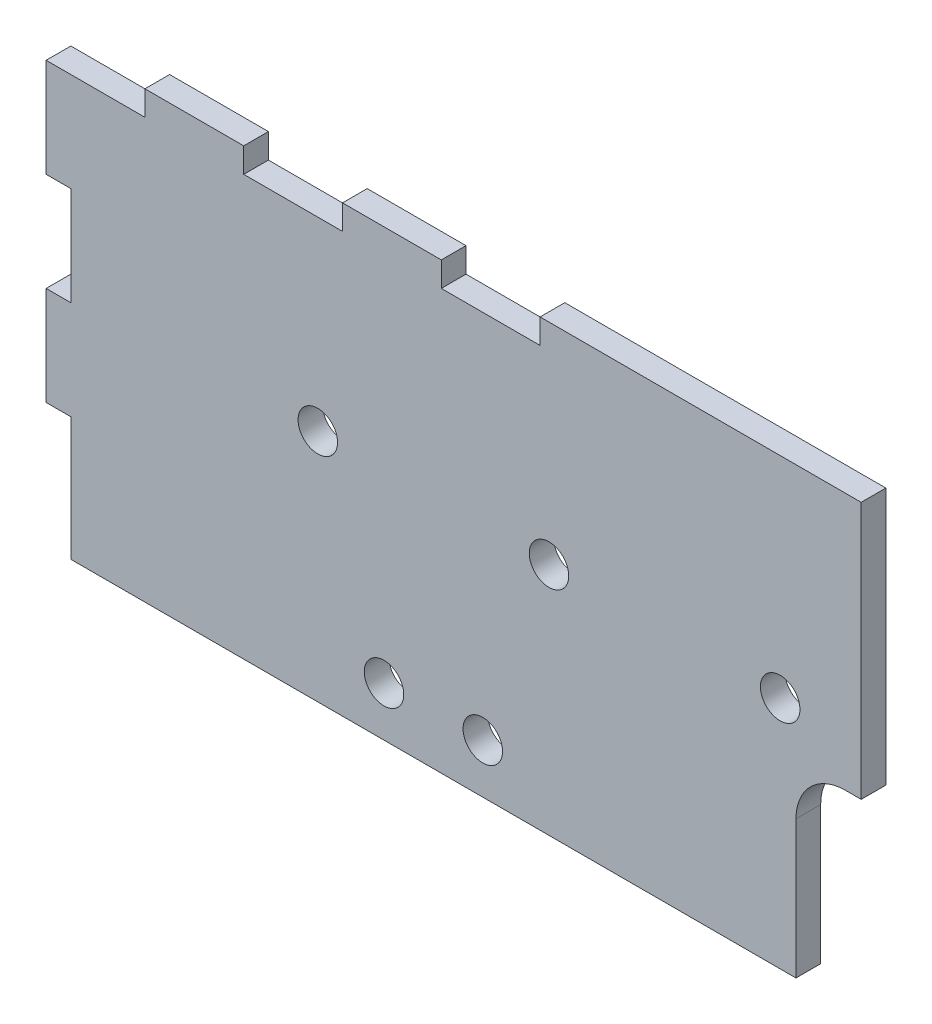
ISO-10303-21;
HEADER;
FILE_DESCRIPTION(('STEP AP214'),'2;1');
FILE_NAME('part.step','',(''),(''),'','','');
FILE_SCHEMA(('AUTOMOTIVE_DESIGN { 1 0 10303 214 1 1 1 1 }'));
ENDSEC;
DATA;
#1=APPLICATION_CONTEXT('core data for automotive mechanical design processes');
#2=APPLICATION_PROTOCOL_DEFINITION('international standard','automotive_design',2000,#1);
#3=PRODUCT_CONTEXT('',#1,'mechanical');
#4=PRODUCT('Part','Part','',(#3));
#5=PRODUCT_RELATED_PRODUCT_CATEGORY('part','',(#4));
#6=PRODUCT_DEFINITION_FORMATION('','',#4);
#7=PRODUCT_DEFINITION_CONTEXT('part definition',#1,'design');
#8=PRODUCT_DEFINITION('design','',#6,#7);
#9=PRODUCT_DEFINITION_SHAPE('','',#8);
#10=(LENGTH_UNIT() NAMED_UNIT(*) SI_UNIT(.MILLI.,.METRE.));
#11=(NAMED_UNIT(*) PLANE_ANGLE_UNIT() SI_UNIT($,.RADIAN.));
#12=(NAMED_UNIT(*) SI_UNIT($,.STERADIAN.) SOLID_ANGLE_UNIT());
#13=UNCERTAINTY_MEASURE_WITH_UNIT(LENGTH_MEASURE(1.E-05),#10,'distance_accuracy_value','');
#14=(GEOMETRIC_REPRESENTATION_CONTEXT(3) GLOBAL_UNCERTAINTY_ASSIGNED_CONTEXT((#13)) GLOBAL_UNIT_ASSIGNED_CONTEXT((#10,
#11,#12)) REPRESENTATION_CONTEXT('',''));
#15=CARTESIAN_POINT('',(0.,0.,0.));
#16=DIRECTION('',(0.,0.,1.));
#17=DIRECTION('',(1.,0.,0.));
#18=AXIS2_PLACEMENT_3D('',#15,#16,#17);
#19=CARTESIAN_POINT('',(40.259,6.35,3.175));
#20=DIRECTION('',(0.,0.,-1.));
#21=DIRECTION('',(-1.,0.,0.));
#22=AXIS2_PLACEMENT_3D('',#19,#20,#21);
#23=CYLINDRICAL_SURFACE('',#22,2.54);
#24=CARTESIAN_POINT('',(40.259,6.35,3.175));
#25=DIRECTION('',(0.,0.,1.));
#26=DIRECTION('',(1.,0.,0.));
#27=AXIS2_PLACEMENT_3D('',#24,#25,#26);
#28=CIRCLE('',#27,2.54);
#29=CARTESIAN_POINT('',(42.799,6.35,3.175));
#30=VERTEX_POINT('',#29);
#31=EDGE_CURVE('E529',#30,#30,#28,.T.);
#32=ORIENTED_EDGE('',*,*,#31,.T.);
#33=EDGE_LOOP('',(#32));
#34=FACE_BOUND('',#33,.T.);
#35=CARTESIAN_POINT('',(40.259,6.35,0.));
#36=DIRECTION('',(0.,0.,1.));
#37=DIRECTION('',(1.,0.,0.));
#38=AXIS2_PLACEMENT_3D('',#35,#36,#37);
#39=CIRCLE('',#38,2.54);
#40=CARTESIAN_POINT('',(42.799,6.35,0.));
#41=VERTEX_POINT('',#40);
#42=EDGE_CURVE('E379',#41,#41,#39,.T.);
#43=ORIENTED_EDGE('',*,*,#42,.F.);
#44=EDGE_LOOP('',(#43));
#45=FACE_BOUND('',#44,.T.);
#46=ADVANCED_FACE('F210',(#34,#45),#23,.F.);
#47=CARTESIAN_POINT('',(52.959,6.35,3.175));
#48=DIRECTION('',(0.,0.,-1.));
#49=DIRECTION('',(-1.,0.,0.));
#50=AXIS2_PLACEMENT_3D('',#47,#48,#49);
#51=CYLINDRICAL_SURFACE('',#50,2.54);
#52=CARTESIAN_POINT('',(52.959,6.35,3.175));
#53=DIRECTION('',(0.,0.,1.));
#54=DIRECTION('',(1.,0.,0.));
#55=AXIS2_PLACEMENT_3D('',#52,#53,#54);
#56=CIRCLE('',#55,2.54);
#57=CARTESIAN_POINT('',(55.499,6.35,3.175));
#58=VERTEX_POINT('',#57);
#59=EDGE_CURVE('E586',#58,#58,#56,.T.);
#60=ORIENTED_EDGE('',*,*,#59,.T.);
#61=EDGE_LOOP('',(#60));
#62=FACE_BOUND('',#61,.T.);
#63=CARTESIAN_POINT('',(52.959,6.35,0.));
#64=DIRECTION('',(0.,0.,1.));
#65=DIRECTION('',(1.,0.,0.));
#66=AXIS2_PLACEMENT_3D('',#63,#64,#65);
#67=CIRCLE('',#66,2.54);
#68=CARTESIAN_POINT('',(55.499,6.35,0.));
#69=VERTEX_POINT('',#68);
#70=EDGE_CURVE('E521',#69,#69,#67,.T.);
#71=ORIENTED_EDGE('',*,*,#70,.F.);
#72=EDGE_LOOP('',(#71));
#73=FACE_BOUND('',#72,.T.);
#74=ADVANCED_FACE('F641',(#62,#73),#51,.F.);
#75=CARTESIAN_POINT('',(31.75,30.1498,3.175));
#76=DIRECTION('',(0.,0.,-1.));
#77=DIRECTION('',(-1.,0.,0.));
#78=AXIS2_PLACEMENT_3D('',#75,#76,#77);
#79=CYLINDRICAL_SURFACE('',#78,2.54);
#80=CARTESIAN_POINT('',(31.75,30.1498,3.175));
#81=DIRECTION('',(0.,0.,1.));
#82=DIRECTION('',(1.,0.,0.));
#83=AXIS2_PLACEMENT_3D('',#80,#81,#82);
#84=CIRCLE('',#83,2.54);
#85=CARTESIAN_POINT('',(34.29,30.1498,3.175));
#86=VERTEX_POINT('',#85);
#87=EDGE_CURVE('E583',#86,#86,#84,.T.);
#88=ORIENTED_EDGE('',*,*,#87,.T.);
#89=EDGE_LOOP('',(#88));
#90=FACE_BOUND('',#89,.T.);
#91=CARTESIAN_POINT('',(31.75,30.1498,0.));
#92=DIRECTION('',(0.,0.,1.));
#93=DIRECTION('',(1.,0.,0.));
#94=AXIS2_PLACEMENT_3D('',#91,#92,#93);
#95=CIRCLE('',#94,2.54);
#96=CARTESIAN_POINT('',(34.29,30.1498,0.));
#97=VERTEX_POINT('',#96);
#98=EDGE_CURVE('E518',#97,#97,#95,.T.);
#99=ORIENTED_EDGE('',*,*,#98,.F.);
#100=EDGE_LOOP('',(#99));
#101=FACE_BOUND('',#100,.T.);
#102=ADVANCED_FACE('F647',(#90,#101),#79,.F.);
#103=CARTESIAN_POINT('',(61.468,30.1498,3.175));
#104=DIRECTION('',(0.,0.,-1.));
#105=DIRECTION('',(-1.,0.,0.));
#106=AXIS2_PLACEMENT_3D('',#103,#104,#105);
#107=CYLINDRICAL_SURFACE('',#106,2.54);
#108=CARTESIAN_POINT('',(61.468,30.1498,3.175));
#109=DIRECTION('',(0.,0.,1.));
#110=DIRECTION('',(1.,0.,0.));
#111=AXIS2_PLACEMENT_3D('',#108,#109,#110);
#112=CIRCLE('',#111,2.54);
#113=CARTESIAN_POINT('',(64.008,30.1498,3.175));
#114=VERTEX_POINT('',#113);
#115=EDGE_CURVE('E580',#114,#114,#112,.T.);
#116=ORIENTED_EDGE('',*,*,#115,.T.);
#117=EDGE_LOOP('',(#116));
#118=FACE_BOUND('',#117,.T.);
#119=CARTESIAN_POINT('',(61.468,30.1498,0.));
#120=DIRECTION('',(0.,0.,1.));
#121=DIRECTION('',(1.,0.,0.));
#122=AXIS2_PLACEMENT_3D('',#119,#120,#121);
#123=CIRCLE('',#122,2.54);
#124=CARTESIAN_POINT('',(64.008,30.1498,0.));
#125=VERTEX_POINT('',#124);
#126=EDGE_CURVE('E515',#125,#125,#123,.T.);
#127=ORIENTED_EDGE('',*,*,#126,.F.);
#128=EDGE_LOOP('',(#127));
#129=FACE_BOUND('',#128,.T.);
#130=ADVANCED_FACE('F656',(#118,#129),#107,.F.);
#131=CARTESIAN_POINT('',(91.186,30.1498,3.175));
#132=DIRECTION('',(0.,0.,-1.));
#133=DIRECTION('',(-1.,0.,0.));
#134=AXIS2_PLACEMENT_3D('',#131,#132,#133);
#135=CYLINDRICAL_SURFACE('',#134,2.54);
#136=CARTESIAN_POINT('',(91.186,30.1498,3.175));
#137=DIRECTION('',(0.,0.,1.));
#138=DIRECTION('',(1.,0.,0.));
#139=AXIS2_PLACEMENT_3D('',#136,#137,#138);
#140=CIRCLE('',#139,2.54);
#141=CARTESIAN_POINT('',(93.726,30.1498,3.175));
#142=VERTEX_POINT('',#141);
#143=EDGE_CURVE('E577',#142,#142,#140,.T.);
#144=ORIENTED_EDGE('',*,*,#143,.T.);
#145=EDGE_LOOP('',(#144));
#146=FACE_BOUND('',#145,.T.);
#147=CARTESIAN_POINT('',(91.186,30.1498,0.));
#148=DIRECTION('',(0.,0.,1.));
#149=DIRECTION('',(1.,0.,0.));
#150=AXIS2_PLACEMENT_3D('',#147,#148,#149);
#151=CIRCLE('',#150,2.54);
#152=CARTESIAN_POINT('',(93.726,30.1498,0.));
#153=VERTEX_POINT('',#152);
#154=EDGE_CURVE('E512',#153,#153,#151,.T.);
#155=ORIENTED_EDGE('',*,*,#154,.F.);
#156=EDGE_LOOP('',(#155));
#157=FACE_BOUND('',#156,.T.);
#158=ADVANCED_FACE('F660',(#146,#157),#135,.F.);
#159=CARTESIAN_POINT('',(0.,53.975,3.175));
#160=DIRECTION('',(0.,-1.,0.));
#161=DIRECTION('',(0.,0.,-1.));
#162=AXIS2_PLACEMENT_3D('',#159,#160,#161);
#163=PLANE('',#162);
#164=DIRECTION('',(0.,0.,-1.));
#165=VECTOR('',#164,1.);
#166=CARTESIAN_POINT('',(47.625,53.975,3.175));
#167=LINE('',#166,#165);
#168=CARTESIAN_POINT('',(47.625,53.975,3.175));
#169=VERTEX_POINT('',#168);
#170=CARTESIAN_POINT('',(47.625,53.975,0.));
#171=VERTEX_POINT('',#170);
#172=EDGE_CURVE('E403',#169,#171,#167,.T.);
#173=ORIENTED_EDGE('',*,*,#172,.F.);
#174=DIRECTION('',(-1.,0.,0.));
#175=VECTOR('',#174,1.);
#176=CARTESIAN_POINT('',(0.,53.975,3.175));
#177=LINE('',#176,#175);
#178=CARTESIAN_POINT('',(60.325,53.975,3.175));
#179=VERTEX_POINT('',#178);
#180=EDGE_CURVE('E381',#179,#169,#177,.T.);
#181=ORIENTED_EDGE('',*,*,#180,.F.);
#182=DIRECTION('',(0.,0.,-1.));
#183=VECTOR('',#182,1.);
#184=CARTESIAN_POINT('',(60.325,53.975,3.175));
#185=LINE('',#184,#183);
#186=CARTESIAN_POINT('',(60.325,53.975,0.));
#187=VERTEX_POINT('',#186);
#188=EDGE_CURVE('E406',#179,#187,#185,.T.);
#189=ORIENTED_EDGE('',*,*,#188,.T.);
#190=DIRECTION('',(-1.,0.,0.));
#191=VECTOR('',#190,1.);
#192=CARTESIAN_POINT('',(0.,53.975,0.));
#193=LINE('',#192,#191);
#194=EDGE_CURVE('E552',#187,#171,#193,.T.);
#195=ORIENTED_EDGE('',*,*,#194,.T.);
#196=EDGE_LOOP('',(#173,#181,#189,#195));
#197=FACE_BOUND('',#196,.T.);
#198=ADVANCED_FACE('F594',(#197),#163,.F.);
#199=DIRECTION('',(0.,0.,-1.));
#200=VECTOR('',#199,1.);
#201=CARTESIAN_POINT('',(22.225,53.975,3.175));
#202=LINE('',#201,#200);
#203=CARTESIAN_POINT('',(22.225,53.975,3.175));
#204=VERTEX_POINT('',#203);
#205=CARTESIAN_POINT('',(22.225,53.975,0.));
#206=VERTEX_POINT('',#205);
#207=EDGE_CURVE('E407',#204,#206,#202,.T.);
#208=ORIENTED_EDGE('',*,*,#207,.F.);
#209=CARTESIAN_POINT('',(34.925,53.975,3.175));
#210=VERTEX_POINT('',#209);
#211=EDGE_CURVE('E378',#210,#204,#177,.T.);
#212=ORIENTED_EDGE('',*,*,#211,.F.);
#213=DIRECTION('',(0.,0.,-1.));
#214=VECTOR('',#213,1.);
#215=CARTESIAN_POINT('',(34.925,53.975,3.175));
#216=LINE('',#215,#214);
#217=CARTESIAN_POINT('',(34.925,53.975,0.));
#218=VERTEX_POINT('',#217);
#219=EDGE_CURVE('E405',#210,#218,#216,.T.);
#220=ORIENTED_EDGE('',*,*,#219,.T.);
#221=EDGE_CURVE('E590',#218,#206,#193,.T.);
#222=ORIENTED_EDGE('',*,*,#221,.T.);
#223=EDGE_LOOP('',(#208,#212,#220,#222));
#224=FACE_BOUND('',#223,.T.);
#225=ADVANCED_FACE('F685',(#224),#163,.F.);
#226=CARTESIAN_POINT('',(9.52499999999999,53.975,3.175));
#227=VERTEX_POINT('',#226);
#228=CARTESIAN_POINT('',(-3.17500000000001,53.975,3.175));
#229=VERTEX_POINT('',#228);
#230=EDGE_CURVE('E365',#227,#229,#177,.T.);
#231=ORIENTED_EDGE('',*,*,#230,.F.);
#232=DIRECTION('',(0.,0.,-1.));
#233=VECTOR('',#232,1.);
#234=CARTESIAN_POINT('',(9.52499999999999,53.975,3.175));
#235=LINE('',#234,#233);
#236=CARTESIAN_POINT('',(9.52499999999998,53.975,0.));
#237=VERTEX_POINT('',#236);
#238=EDGE_CURVE('E409',#227,#237,#235,.T.);
#239=ORIENTED_EDGE('',*,*,#238,.T.);
#240=CARTESIAN_POINT('',(-3.17500000000001,53.975,0.));
#241=VERTEX_POINT('',#240);
#242=EDGE_CURVE('E393',#237,#241,#193,.T.);
#243=ORIENTED_EDGE('',*,*,#242,.T.);
#244=DIRECTION('',(0.,0.,-1.));
#245=VECTOR('',#244,1.);
#246=CARTESIAN_POINT('',(-3.17500000000001,53.975,3.175));
#247=LINE('',#246,#245);
#248=EDGE_CURVE('E386',#229,#241,#247,.T.);
#249=ORIENTED_EDGE('',*,*,#248,.F.);
#250=EDGE_LOOP('',(#231,#239,#243,#249));
#251=FACE_BOUND('',#250,.T.);
#252=ADVANCED_FACE('F391',(#251),#163,.F.);
#253=CARTESIAN_POINT('',(-3.175,0.,3.175));
#254=DIRECTION('',(1.,0.,0.));
#255=DIRECTION('',(0.,1.,0.));
#256=AXIS2_PLACEMENT_3D('',#253,#254,#255);
#257=PLANE('',#256);
#258=DIRECTION('',(0.,-1.,0.));
#259=VECTOR('',#258,1.);
#260=CARTESIAN_POINT('',(-3.175,0.,0.));
#261=LINE('',#260,#259);
#262=CARTESIAN_POINT('',(-3.175,41.275,0.));
#263=VERTEX_POINT('',#262);
#264=EDGE_CURVE('E548',#241,#263,#261,.T.);
#265=ORIENTED_EDGE('',*,*,#264,.T.);
#266=DIRECTION('',(0.,0.,-1.));
#267=VECTOR('',#266,1.);
#268=CARTESIAN_POINT('',(-3.175,41.275,3.175));
#269=LINE('',#268,#267);
#270=CARTESIAN_POINT('',(-3.175,41.275,3.175));
#271=VERTEX_POINT('',#270);
#272=EDGE_CURVE('E387',#271,#263,#269,.T.);
#273=ORIENTED_EDGE('',*,*,#272,.F.);
#274=DIRECTION('',(0.,-1.,0.));
#275=VECTOR('',#274,1.);
#276=CARTESIAN_POINT('',(-3.175,0.,3.175));
#277=LINE('',#276,#275);
#278=EDGE_CURVE('E371',#229,#271,#277,.T.);
#279=ORIENTED_EDGE('',*,*,#278,.F.);
#280=ORIENTED_EDGE('',*,*,#248,.T.);
#281=EDGE_LOOP('',(#265,#273,#279,#280));
#282=FACE_BOUND('',#281,.T.);
#283=ADVANCED_FACE('F385',(#282),#257,.F.);
#284=CARTESIAN_POINT('',(0.,41.275,3.175));
#285=DIRECTION('',(0.,-1.,0.));
#286=DIRECTION('',(0.,0.,-1.));
#287=AXIS2_PLACEMENT_3D('',#284,#285,#286);
#288=PLANE('',#287);
#289=DIRECTION('',(-1.,0.,0.));
#290=VECTOR('',#289,1.);
#291=CARTESIAN_POINT('',(0.,41.275,0.));
#292=LINE('',#291,#290);
#293=CARTESIAN_POINT('',(0.,41.275,0.));
#294=VERTEX_POINT('',#293);
#295=EDGE_CURVE('E546',#294,#263,#292,.T.);
#296=ORIENTED_EDGE('',*,*,#295,.F.);
#297=DIRECTION('',(0.,0.,-1.));
#298=VECTOR('',#297,1.);
#299=CARTESIAN_POINT('',(0.,41.275,3.175));
#300=LINE('',#299,#298);
#301=CARTESIAN_POINT('',(0.,41.275,3.175));
#302=VERTEX_POINT('',#301);
#303=EDGE_CURVE('E399',#302,#294,#300,.T.);
#304=ORIENTED_EDGE('',*,*,#303,.F.);
#305=DIRECTION('',(-1.,0.,0.));
#306=VECTOR('',#305,1.);
#307=CARTESIAN_POINT('',(0.,41.275,3.175));
#308=LINE('',#307,#306);
#309=EDGE_CURVE('E389',#302,#271,#308,.T.);
#310=ORIENTED_EDGE('',*,*,#309,.T.);
#311=ORIENTED_EDGE('',*,*,#272,.T.);
#312=EDGE_LOOP('',(#296,#304,#310,#311));
#313=FACE_BOUND('',#312,.T.);
#314=ADVANCED_FACE('F547',(#313),#288,.T.);
#315=CARTESIAN_POINT('',(0.,0.,3.175));
#316=DIRECTION('',(-1.,0.,0.));
#317=DIRECTION('',(0.,-1.,0.));
#318=AXIS2_PLACEMENT_3D('',#315,#316,#317);
#319=PLANE('',#318);
#320=DIRECTION('',(0.,1.,0.));
#321=VECTOR('',#320,1.);
#322=CARTESIAN_POINT('',(0.,0.,0.));
#323=LINE('',#322,#321);
#324=CARTESIAN_POINT('',(0.,28.575,0.));
#325=VERTEX_POINT('',#324);
#326=EDGE_CURVE('E541',#325,#294,#323,.T.);
#327=ORIENTED_EDGE('',*,*,#326,.F.);
#328=DIRECTION('',(0.,0.,1.));
#329=VECTOR('',#328,1.);
#330=CARTESIAN_POINT('',(0.,28.575,3.175));
#331=LINE('',#330,#329);
#332=CARTESIAN_POINT('',(0.,28.575,3.175));
#333=VERTEX_POINT('',#332);
#334=EDGE_CURVE('E395',#325,#333,#331,.T.);
#335=ORIENTED_EDGE('',*,*,#334,.T.);
#336=DIRECTION('',(0.,1.,0.));
#337=VECTOR('',#336,1.);
#338=CARTESIAN_POINT('',(0.,0.,3.175));
#339=LINE('',#338,#337);
#340=EDGE_CURVE('E543',#333,#302,#339,.T.);
#341=ORIENTED_EDGE('',*,*,#340,.T.);
#342=ORIENTED_EDGE('',*,*,#303,.T.);
#343=EDGE_LOOP('',(#327,#335,#341,#342));
#344=FACE_BOUND('',#343,.T.);
#345=ADVANCED_FACE('F540',(#344),#319,.T.);
#346=CARTESIAN_POINT('',(0.,0.,3.175));
#347=VERTEX_POINT('',#346);
#348=CARTESIAN_POINT('',(0.,15.875,3.175));
#349=VERTEX_POINT('',#348);
#350=EDGE_CURVE('E568',#347,#349,#339,.T.);
#351=ORIENTED_EDGE('',*,*,#350,.T.);
#352=DIRECTION('',(0.,0.,-1.));
#353=VECTOR('',#352,1.);
#354=CARTESIAN_POINT('',(0.,15.875,3.175));
#355=LINE('',#354,#353);
#356=CARTESIAN_POINT('',(0.,15.875,0.));
#357=VERTEX_POINT('',#356);
#358=EDGE_CURVE('E397',#349,#357,#355,.T.);
#359=ORIENTED_EDGE('',*,*,#358,.T.);
#360=CARTESIAN_POINT('',(0.,0.,0.));
#361=VERTEX_POINT('',#360);
#362=EDGE_CURVE('E550',#361,#357,#323,.T.);
#363=ORIENTED_EDGE('',*,*,#362,.F.);
#364=DIRECTION('',(0.,0.,-1.));
#365=VECTOR('',#364,1.);
#366=CARTESIAN_POINT('',(0.,0.,3.175));
#367=LINE('',#366,#365);
#368=EDGE_CURVE('E534',#347,#361,#367,.T.);
#369=ORIENTED_EDGE('',*,*,#368,.F.);
#370=EDGE_LOOP('',(#351,#359,#363,#369));
#371=FACE_BOUND('',#370,.T.);
#372=ADVANCED_FACE('F610',(#371),#319,.T.);
#373=CARTESIAN_POINT('',(0.,0.,3.175));
#374=DIRECTION('',(0.,1.,0.));
#375=DIRECTION('',(-1.,0.,0.));
#376=AXIS2_PLACEMENT_3D('',#373,#374,#375);
#377=PLANE('',#376);
#378=DIRECTION('',(1.,0.,0.));
#379=VECTOR('',#378,1.);
#380=CARTESIAN_POINT('',(0.,0.,0.));
#381=LINE('',#380,#379);
#382=CARTESIAN_POINT('',(93.218,0.,0.));
#383=VERTEX_POINT('',#382);
#384=EDGE_CURVE('E507',#361,#383,#381,.T.);
#385=ORIENTED_EDGE('',*,*,#384,.T.);
#386=DIRECTION('',(0.,0.,-1.));
#387=VECTOR('',#386,1.);
#388=CARTESIAN_POINT('',(93.218,0.,3.175));
#389=LINE('',#388,#387);
#390=CARTESIAN_POINT('',(93.218,0.,3.175));
#391=VERTEX_POINT('',#390);
#392=EDGE_CURVE('E531',#391,#383,#389,.T.);
#393=ORIENTED_EDGE('',*,*,#392,.F.);
#394=DIRECTION('',(1.,0.,0.));
#395=VECTOR('',#394,1.);
#396=CARTESIAN_POINT('',(0.,0.,3.175));
#397=LINE('',#396,#395);
#398=EDGE_CURVE('E564',#347,#391,#397,.T.);
#399=ORIENTED_EDGE('',*,*,#398,.F.);
#400=ORIENTED_EDGE('',*,*,#368,.T.);
#401=EDGE_LOOP('',(#385,#393,#399,#400));
#402=FACE_BOUND('',#401,.T.);
#403=ADVANCED_FACE('F559',(#402),#377,.F.);
#404=CARTESIAN_POINT('',(93.218,0.,3.175));
#405=DIRECTION('',(-1.,0.,0.));
#406=DIRECTION('',(0.,0.,1.));
#407=AXIS2_PLACEMENT_3D('',#404,#405,#406);
#408=PLANE('',#407);
#409=DIRECTION('',(0.,1.,0.));
#410=VECTOR('',#409,1.);
#411=CARTESIAN_POINT('',(93.218,0.,0.));
#412=LINE('',#411,#410);
#413=CARTESIAN_POINT('',(93.218,17.7251121402454,0.));
#414=VERTEX_POINT('',#413);
#415=EDGE_CURVE('E503',#383,#414,#412,.T.);
#416=ORIENTED_EDGE('',*,*,#415,.T.);
#417=DIRECTION('',(0.,0.,-1.));
#418=VECTOR('',#417,1.);
#419=CARTESIAN_POINT('',(93.218,17.7251121402454,3.175));
#420=LINE('',#419,#418);
#421=CARTESIAN_POINT('',(93.218,17.7251121402454,3.175));
#422=VERTEX_POINT('',#421);
#423=EDGE_CURVE('E225',#414,#422,#420,.F.);
#424=ORIENTED_EDGE('',*,*,#423,.T.);
#425=DIRECTION('',(0.,1.,0.));
#426=VECTOR('',#425,1.);
#427=CARTESIAN_POINT('',(93.218,0.,3.175));
#428=LINE('',#427,#426);
#429=EDGE_CURVE('E563',#391,#422,#428,.T.);
#430=ORIENTED_EDGE('',*,*,#429,.F.);
#431=ORIENTED_EDGE('',*,*,#392,.T.);
#432=EDGE_LOOP('',(#416,#424,#430,#431));
#433=FACE_BOUND('',#432,.T.);
#434=ADVANCED_FACE('F562',(#433),#408,.F.);
#435=CARTESIAN_POINT('',(0.,24.0751121402454,3.175));
#436=DIRECTION('',(0.,1.,0.));
#437=DIRECTION('',(0.,0.,1.));
#438=AXIS2_PLACEMENT_3D('',#435,#436,#437);
#439=PLANE('',#438);
#440=DIRECTION('',(1.,0.,0.));
#441=VECTOR('',#440,1.);
#442=CARTESIAN_POINT('',(0.,24.0751121402454,3.175));
#443=LINE('',#442,#441);
#444=CARTESIAN_POINT('',(99.568,24.0751121402454,3.175));
#445=VERTEX_POINT('',#444);
#446=CARTESIAN_POINT('',(101.6,24.0751121402454,3.175));
#447=VERTEX_POINT('',#446);
#448=EDGE_CURVE('E493',#445,#447,#443,.T.);
#449=ORIENTED_EDGE('',*,*,#448,.F.);
#450=DIRECTION('',(0.,0.,-1.));
#451=VECTOR('',#450,1.);
#452=CARTESIAN_POINT('',(99.568,24.0751121402454,0.));
#453=LINE('',#452,#451);
#454=CARTESIAN_POINT('',(99.568,24.0751121402454,0.));
#455=VERTEX_POINT('',#454);
#456=EDGE_CURVE('E451',#445,#455,#453,.T.);
#457=ORIENTED_EDGE('',*,*,#456,.T.);
#458=DIRECTION('',(1.,0.,0.));
#459=VECTOR('',#458,1.);
#460=CARTESIAN_POINT('',(0.,24.0751121402454,0.));
#461=LINE('',#460,#459);
#462=CARTESIAN_POINT('',(101.6,24.0751121402454,0.));
#463=VERTEX_POINT('',#462);
#464=EDGE_CURVE('E491',#455,#463,#461,.T.);
#465=ORIENTED_EDGE('',*,*,#464,.T.);
#466=DIRECTION('',(0.,0.,-1.));
#467=VECTOR('',#466,1.);
#468=CARTESIAN_POINT('',(101.6,24.0751121402454,3.175));
#469=LINE('',#468,#467);
#470=EDGE_CURVE('E528',#447,#463,#469,.T.);
#471=ORIENTED_EDGE('',*,*,#470,.F.);
#472=EDGE_LOOP('',(#449,#457,#465,#471));
#473=FACE_BOUND('',#472,.T.);
#474=ADVANCED_FACE('F489',(#473),#439,.F.);
#475=CARTESIAN_POINT('',(101.6,0.,3.175));
#476=DIRECTION('',(1.,0.,0.));
#477=DIRECTION('',(0.,0.,-1.));
#478=AXIS2_PLACEMENT_3D('',#475,#476,#477);
#479=PLANE('',#478);
#480=DIRECTION('',(0.,-1.,0.));
#481=VECTOR('',#480,1.);
#482=CARTESIAN_POINT('',(101.6,0.,0.));
#483=LINE('',#482,#481);
#484=CARTESIAN_POINT('',(101.6,57.15,0.));
#485=VERTEX_POINT('',#484);
#486=EDGE_CURVE('E502',#485,#463,#483,.T.);
#487=ORIENTED_EDGE('',*,*,#486,.F.);
#488=DIRECTION('',(0.,0.,-1.));
#489=VECTOR('',#488,1.);
#490=CARTESIAN_POINT('',(101.6,57.15,3.175));
#491=LINE('',#490,#489);
#492=CARTESIAN_POINT('',(101.6,57.15,3.175));
#493=VERTEX_POINT('',#492);
#494=EDGE_CURVE('E526',#493,#485,#491,.T.);
#495=ORIENTED_EDGE('',*,*,#494,.F.);
#496=DIRECTION('',(0.,-1.,0.));
#497=VECTOR('',#496,1.);
#498=CARTESIAN_POINT('',(101.6,0.,3.175));
#499=LINE('',#498,#497);
#500=EDGE_CURVE('E566',#493,#447,#499,.T.);
#501=ORIENTED_EDGE('',*,*,#500,.T.);
#502=ORIENTED_EDGE('',*,*,#470,.T.);
#503=EDGE_LOOP('',(#487,#495,#501,#502));
#504=FACE_BOUND('',#503,.T.);
#505=ADVANCED_FACE('F668',(#504),#479,.T.);
#506=CARTESIAN_POINT('',(0.,57.15,3.175));
#507=DIRECTION('',(0.,1.,0.));
#508=DIRECTION('',(0.,0.,1.));
#509=AXIS2_PLACEMENT_3D('',#506,#507,#508);
#510=PLANE('',#509);
#511=DIRECTION('',(1.,0.,0.));
#512=VECTOR('',#511,1.);
#513=CARTESIAN_POINT('',(0.,57.15,0.));
#514=LINE('',#513,#512);
#515=CARTESIAN_POINT('',(60.325,57.15,0.));
#516=VERTEX_POINT('',#515);
#517=EDGE_CURVE('E505',#516,#485,#514,.T.);
#518=ORIENTED_EDGE('',*,*,#517,.F.);
#519=DIRECTION('',(0.,0.,-1.));
#520=VECTOR('',#519,1.);
#521=CARTESIAN_POINT('',(60.325,57.15,3.175));
#522=LINE('',#521,#520);
#523=CARTESIAN_POINT('',(60.325,57.15,3.175));
#524=VERTEX_POINT('',#523);
#525=EDGE_CURVE('E467',#524,#516,#522,.T.);
#526=ORIENTED_EDGE('',*,*,#525,.F.);
#527=DIRECTION('',(1.,0.,0.));
#528=VECTOR('',#527,1.);
#529=CARTESIAN_POINT('',(0.,57.15,3.175));
#530=LINE('',#529,#528);
#531=EDGE_CURVE('E574',#524,#493,#530,.T.);
#532=ORIENTED_EDGE('',*,*,#531,.T.);
#533=ORIENTED_EDGE('',*,*,#494,.T.);
#534=EDGE_LOOP('',(#518,#526,#532,#533));
#535=FACE_BOUND('',#534,.T.);
#536=ADVANCED_FACE('F665',(#535),#510,.T.);
#537=CARTESIAN_POINT('',(0.,0.,0.));
#538=DIRECTION('',(0.,0.,1.));
#539=DIRECTION('',(1.,0.,0.));
#540=AXIS2_PLACEMENT_3D('',#537,#538,#539);
#541=PLANE('',#540);
#542=ORIENTED_EDGE('',*,*,#194,.F.);
#543=DIRECTION('',(0.,1.,0.));
#544=VECTOR('',#543,1.);
#545=CARTESIAN_POINT('',(60.325,53.975,0.));
#546=LINE('',#545,#544);
#547=EDGE_CURVE('E478',#187,#516,#546,.T.);
#548=ORIENTED_EDGE('',*,*,#547,.T.);
#549=ORIENTED_EDGE('',*,*,#517,.T.);
#550=ORIENTED_EDGE('',*,*,#486,.T.);
#551=ORIENTED_EDGE('',*,*,#464,.F.);
#552=CARTESIAN_POINT('',(99.568,17.7251121402454,0.));
#553=DIRECTION('',(0.,0.,1.));
#554=DIRECTION('',(1.,0.,0.));
#555=AXIS2_PLACEMENT_3D('',#552,#553,#554);
#556=CIRCLE('',#555,6.35);
#557=EDGE_CURVE('E218',#455,#414,#556,.T.);
#558=ORIENTED_EDGE('',*,*,#557,.T.);
#559=ORIENTED_EDGE('',*,*,#415,.F.);
#560=ORIENTED_EDGE('',*,*,#384,.F.);
#561=ORIENTED_EDGE('',*,*,#362,.T.);
#562=DIRECTION('',(-1.,0.,0.));
#563=VECTOR('',#562,1.);
#564=CARTESIAN_POINT('',(0.,15.875,0.));
#565=LINE('',#564,#563);
#566=CARTESIAN_POINT('',(-3.175,15.875,0.));
#567=VERTEX_POINT('',#566);
#568=EDGE_CURVE('E419',#357,#567,#565,.T.);
#569=ORIENTED_EDGE('',*,*,#568,.T.);
#570=DIRECTION('',(0.,-1.,0.));
#571=VECTOR('',#570,1.);
#572=CARTESIAN_POINT('',(-3.175,28.575,0.));
#573=LINE('',#572,#571);
#574=CARTESIAN_POINT('',(-3.175,28.575,0.));
#575=VERTEX_POINT('',#574);
#576=EDGE_CURVE('E422',#575,#567,#573,.T.);
#577=ORIENTED_EDGE('',*,*,#576,.F.);
#578=DIRECTION('',(-1.,0.,0.));
#579=VECTOR('',#578,1.);
#580=CARTESIAN_POINT('',(0.,28.575,0.));
#581=LINE('',#580,#579);
#582=EDGE_CURVE('E414',#325,#575,#581,.T.);
#583=ORIENTED_EDGE('',*,*,#582,.F.);
#584=ORIENTED_EDGE('',*,*,#326,.T.);
#585=ORIENTED_EDGE('',*,*,#295,.T.);
#586=ORIENTED_EDGE('',*,*,#264,.F.);
#587=ORIENTED_EDGE('',*,*,#242,.F.);
#588=DIRECTION('',(0.,1.,0.));
#589=VECTOR('',#588,1.);
#590=CARTESIAN_POINT('',(9.52499999999999,53.975,0.));
#591=LINE('',#590,#589);
#592=CARTESIAN_POINT('',(9.52499999999997,57.15,0.));
#593=VERTEX_POINT('',#592);
#594=EDGE_CURVE('E436',#237,#593,#591,.T.);
#595=ORIENTED_EDGE('',*,*,#594,.T.);
#596=DIRECTION('',(1.,0.,0.));
#597=VECTOR('',#596,1.);
#598=CARTESIAN_POINT('',(9.52499999999997,57.15,0.));
#599=LINE('',#598,#597);
#600=CARTESIAN_POINT('',(22.225,57.15,0.));
#601=VERTEX_POINT('',#600);
#602=EDGE_CURVE('E440',#593,#601,#599,.T.);
#603=ORIENTED_EDGE('',*,*,#602,.T.);
#604=DIRECTION('',(0.,1.,0.));
#605=VECTOR('',#604,1.);
#606=CARTESIAN_POINT('',(22.225,53.975,0.));
#607=LINE('',#606,#605);
#608=EDGE_CURVE('E443',#206,#601,#607,.T.);
#609=ORIENTED_EDGE('',*,*,#608,.F.);
#610=ORIENTED_EDGE('',*,*,#221,.F.);
#611=DIRECTION('',(0.,1.,0.));
#612=VECTOR('',#611,1.);
#613=CARTESIAN_POINT('',(34.925,53.975,0.));
#614=LINE('',#613,#612);
#615=CARTESIAN_POINT('',(34.925,57.15,0.));
#616=VERTEX_POINT('',#615);
#617=EDGE_CURVE('E457',#218,#616,#614,.T.);
#618=ORIENTED_EDGE('',*,*,#617,.T.);
#619=DIRECTION('',(1.,0.,0.));
#620=VECTOR('',#619,1.);
#621=CARTESIAN_POINT('',(34.925,57.15,0.));
#622=LINE('',#621,#620);
#623=CARTESIAN_POINT('',(47.625,57.15,0.));
#624=VERTEX_POINT('',#623);
#625=EDGE_CURVE('E463',#616,#624,#622,.T.);
#626=ORIENTED_EDGE('',*,*,#625,.T.);
#627=DIRECTION('',(0.,1.,0.));
#628=VECTOR('',#627,1.);
#629=CARTESIAN_POINT('',(47.625,53.975,0.));
#630=LINE('',#629,#628);
#631=EDGE_CURVE('E466',#171,#624,#630,.T.);
#632=ORIENTED_EDGE('',*,*,#631,.F.);
#633=EDGE_LOOP('',(#542,#548,#549,#550,#551,#558,#559,#560,#561,#569,#577,#583,#584,#585,#586,
#587,#595,#603,#609,#610,#618,#626,#632));
#634=FACE_BOUND('',#633,.T.);
#635=ORIENTED_EDGE('',*,*,#154,.T.);
#636=EDGE_LOOP('',(#635));
#637=FACE_BOUND('',#636,.T.);
#638=ORIENTED_EDGE('',*,*,#126,.T.);
#639=EDGE_LOOP('',(#638));
#640=FACE_BOUND('',#639,.T.);
#641=ORIENTED_EDGE('',*,*,#98,.T.);
#642=EDGE_LOOP('',(#641));
#643=FACE_BOUND('',#642,.T.);
#644=ORIENTED_EDGE('',*,*,#70,.T.);
#645=EDGE_LOOP('',(#644));
#646=FACE_BOUND('',#645,.T.);
#647=ORIENTED_EDGE('',*,*,#42,.T.);
#648=EDGE_LOOP('',(#647));
#649=FACE_BOUND('',#648,.T.);
#650=ADVANCED_FACE('F498',(#634,#637,#640,#643,#646,#649),#541,.F.);
#651=CARTESIAN_POINT('',(0.,0.,3.175));
#652=DIRECTION('',(0.,0.,1.));
#653=DIRECTION('',(1.,0.,0.));
#654=AXIS2_PLACEMENT_3D('',#651,#652,#653);
#655=PLANE('',#654);
#656=DIRECTION('',(0.,1.,0.));
#657=VECTOR('',#656,1.);
#658=CARTESIAN_POINT('',(60.325,53.975,3.175));
#659=LINE('',#658,#657);
#660=EDGE_CURVE('E475',#179,#524,#659,.T.);
#661=ORIENTED_EDGE('',*,*,#660,.F.);
#662=ORIENTED_EDGE('',*,*,#180,.T.);
#663=DIRECTION('',(0.,1.,0.));
#664=VECTOR('',#663,1.);
#665=CARTESIAN_POINT('',(47.625,53.975,3.175));
#666=LINE('',#665,#664);
#667=CARTESIAN_POINT('',(47.625,57.15,3.175));
#668=VERTEX_POINT('',#667);
#669=EDGE_CURVE('E456',#169,#668,#666,.T.);
#670=ORIENTED_EDGE('',*,*,#669,.T.);
#671=DIRECTION('',(1.,0.,0.));
#672=VECTOR('',#671,1.);
#673=CARTESIAN_POINT('',(34.925,57.15,3.175));
#674=LINE('',#673,#672);
#675=CARTESIAN_POINT('',(34.925,57.15,3.175));
#676=VERTEX_POINT('',#675);
#677=EDGE_CURVE('E453',#676,#668,#674,.T.);
#678=ORIENTED_EDGE('',*,*,#677,.F.);
#679=DIRECTION('',(0.,1.,0.));
#680=VECTOR('',#679,1.);
#681=CARTESIAN_POINT('',(34.925,53.975,3.175));
#682=LINE('',#681,#680);
#683=EDGE_CURVE('E459',#210,#676,#682,.T.);
#684=ORIENTED_EDGE('',*,*,#683,.F.);
#685=ORIENTED_EDGE('',*,*,#211,.T.);
#686=DIRECTION('',(0.,1.,0.));
#687=VECTOR('',#686,1.);
#688=CARTESIAN_POINT('',(22.225,53.975,3.175));
#689=LINE('',#688,#687);
#690=CARTESIAN_POINT('',(22.225,57.15,3.175));
#691=VERTEX_POINT('',#690);
#692=EDGE_CURVE('E435',#204,#691,#689,.T.);
#693=ORIENTED_EDGE('',*,*,#692,.T.);
#694=DIRECTION('',(1.,0.,0.));
#695=VECTOR('',#694,1.);
#696=CARTESIAN_POINT('',(9.52499999999997,57.15,3.175));
#697=LINE('',#696,#695);
#698=CARTESIAN_POINT('',(9.52499999999997,57.15,3.175));
#699=VERTEX_POINT('',#698);
#700=EDGE_CURVE('E432',#699,#691,#697,.T.);
#701=ORIENTED_EDGE('',*,*,#700,.F.);
#702=DIRECTION('',(0.,1.,0.));
#703=VECTOR('',#702,1.);
#704=CARTESIAN_POINT('',(9.52499999999999,53.975,3.175));
#705=LINE('',#704,#703);
#706=EDGE_CURVE('E375',#227,#699,#705,.T.);
#707=ORIENTED_EDGE('',*,*,#706,.F.);
#708=ORIENTED_EDGE('',*,*,#230,.T.);
#709=ORIENTED_EDGE('',*,*,#278,.T.);
#710=ORIENTED_EDGE('',*,*,#309,.F.);
#711=ORIENTED_EDGE('',*,*,#340,.F.);
#712=DIRECTION('',(-1.,0.,0.));
#713=VECTOR('',#712,1.);
#714=CARTESIAN_POINT('',(0.,28.575,3.175));
#715=LINE('',#714,#713);
#716=CARTESIAN_POINT('',(-3.175,28.575,3.175));
#717=VERTEX_POINT('',#716);
#718=EDGE_CURVE('E416',#333,#717,#715,.T.);
#719=ORIENTED_EDGE('',*,*,#718,.T.);
#720=DIRECTION('',(0.,-1.,0.));
#721=VECTOR('',#720,1.);
#722=CARTESIAN_POINT('',(-3.175,28.575,3.175));
#723=LINE('',#722,#721);
#724=CARTESIAN_POINT('',(-3.175,15.875,3.175));
#725=VERTEX_POINT('',#724);
#726=EDGE_CURVE('E413',#717,#725,#723,.T.);
#727=ORIENTED_EDGE('',*,*,#726,.T.);
#728=DIRECTION('',(-1.,0.,0.));
#729=VECTOR('',#728,1.);
#730=CARTESIAN_POINT('',(0.,15.875,3.175));
#731=LINE('',#730,#729);
#732=EDGE_CURVE('E410',#349,#725,#731,.T.);
#733=ORIENTED_EDGE('',*,*,#732,.F.);
#734=ORIENTED_EDGE('',*,*,#350,.F.);
#735=ORIENTED_EDGE('',*,*,#398,.T.);
#736=ORIENTED_EDGE('',*,*,#429,.T.);
#737=CARTESIAN_POINT('',(99.568,17.7251121402454,3.175));
#738=DIRECTION('',(0.,0.,1.));
#739=DIRECTION('',(1.,0.,0.));
#740=AXIS2_PLACEMENT_3D('',#737,#738,#739);
#741=CIRCLE('',#740,6.35);
#742=EDGE_CURVE('E12',#422,#445,#741,.F.);
#743=ORIENTED_EDGE('',*,*,#742,.T.);
#744=ORIENTED_EDGE('',*,*,#448,.T.);
#745=ORIENTED_EDGE('',*,*,#500,.F.);
#746=ORIENTED_EDGE('',*,*,#531,.F.);
#747=EDGE_LOOP('',(#661,#662,#670,#678,#684,#685,#693,#701,#707,#708,#709,#710,#711,#719,#727,
#733,#734,#735,#736,#743,#744,#745,#746));
#748=FACE_BOUND('',#747,.T.);
#749=ORIENTED_EDGE('',*,*,#143,.F.);
#750=EDGE_LOOP('',(#749));
#751=FACE_BOUND('',#750,.T.);
#752=ORIENTED_EDGE('',*,*,#115,.F.);
#753=EDGE_LOOP('',(#752));
#754=FACE_BOUND('',#753,.T.);
#755=ORIENTED_EDGE('',*,*,#87,.F.);
#756=EDGE_LOOP('',(#755));
#757=FACE_BOUND('',#756,.T.);
#758=ORIENTED_EDGE('',*,*,#59,.F.);
#759=EDGE_LOOP('',(#758));
#760=FACE_BOUND('',#759,.T.);
#761=ORIENTED_EDGE('',*,*,#31,.F.);
#762=EDGE_LOOP('',(#761));
#763=FACE_BOUND('',#762,.T.);
#764=ADVANCED_FACE('F368',(#748,#751,#754,#757,#760,#763),#655,.T.);
#765=CARTESIAN_POINT('',(60.325,53.975,3.175));
#766=DIRECTION('',(-1.,0.,0.));
#767=DIRECTION('',(0.,0.,1.));
#768=AXIS2_PLACEMENT_3D('',#765,#766,#767);
#769=PLANE('',#768);
#770=ORIENTED_EDGE('',*,*,#547,.F.);
#771=ORIENTED_EDGE('',*,*,#188,.F.);
#772=ORIENTED_EDGE('',*,*,#660,.T.);
#773=ORIENTED_EDGE('',*,*,#525,.T.);
#774=EDGE_LOOP('',(#770,#771,#772,#773));
#775=FACE_BOUND('',#774,.T.);
#776=ADVANCED_FACE('F763',(#775),#769,.T.);
#777=CARTESIAN_POINT('',(34.925,53.975,3.175));
#778=DIRECTION('',(-1.,0.,0.));
#779=DIRECTION('',(0.,0.,1.));
#780=AXIS2_PLACEMENT_3D('',#777,#778,#779);
#781=PLANE('',#780);
#782=ORIENTED_EDGE('',*,*,#617,.F.);
#783=ORIENTED_EDGE('',*,*,#219,.F.);
#784=ORIENTED_EDGE('',*,*,#683,.T.);
#785=DIRECTION('',(0.,0.,-1.));
#786=VECTOR('',#785,1.);
#787=CARTESIAN_POINT('',(34.925,57.15,3.175));
#788=LINE('',#787,#786);
#789=EDGE_CURVE('E444',#676,#616,#788,.T.);
#790=ORIENTED_EDGE('',*,*,#789,.T.);
#791=EDGE_LOOP('',(#782,#783,#784,#790));
#792=FACE_BOUND('',#791,.T.);
#793=ADVANCED_FACE('F768',(#792),#781,.T.);
#794=CARTESIAN_POINT('',(47.625,53.975,3.175));
#795=DIRECTION('',(-1.,0.,0.));
#796=DIRECTION('',(0.,0.,1.));
#797=AXIS2_PLACEMENT_3D('',#794,#795,#796);
#798=PLANE('',#797);
#799=ORIENTED_EDGE('',*,*,#631,.T.);
#800=DIRECTION('',(0.,0.,-1.));
#801=VECTOR('',#800,1.);
#802=CARTESIAN_POINT('',(47.625,57.15,3.175));
#803=LINE('',#802,#801);
#804=EDGE_CURVE('E462',#668,#624,#803,.T.);
#805=ORIENTED_EDGE('',*,*,#804,.F.);
#806=ORIENTED_EDGE('',*,*,#669,.F.);
#807=ORIENTED_EDGE('',*,*,#172,.T.);
#808=EDGE_LOOP('',(#799,#805,#806,#807));
#809=FACE_BOUND('',#808,.T.);
#810=ADVANCED_FACE('F602',(#809),#798,.F.);
#811=CARTESIAN_POINT('',(34.925,57.15,3.175));
#812=DIRECTION('',(0.,1.,0.));
#813=DIRECTION('',(0.,0.,1.));
#814=AXIS2_PLACEMENT_3D('',#811,#812,#813);
#815=PLANE('',#814);
#816=ORIENTED_EDGE('',*,*,#625,.F.);
#817=ORIENTED_EDGE('',*,*,#789,.F.);
#818=ORIENTED_EDGE('',*,*,#677,.T.);
#819=ORIENTED_EDGE('',*,*,#804,.T.);
#820=EDGE_LOOP('',(#816,#817,#818,#819));
#821=FACE_BOUND('',#820,.T.);
#822=ADVANCED_FACE('F770',(#821),#815,.T.);
#823=CARTESIAN_POINT('',(9.52499999999999,53.975,3.175));
#824=DIRECTION('',(-1.,0.,0.));
#825=DIRECTION('',(0.,-1.,0.));
#826=AXIS2_PLACEMENT_3D('',#823,#824,#825);
#827=PLANE('',#826);
#828=ORIENTED_EDGE('',*,*,#594,.F.);
#829=ORIENTED_EDGE('',*,*,#238,.F.);
#830=ORIENTED_EDGE('',*,*,#706,.T.);
#831=DIRECTION('',(0.,0.,-1.));
#832=VECTOR('',#831,1.);
#833=CARTESIAN_POINT('',(9.52499999999997,57.15,3.175));
#834=LINE('',#833,#832);
#835=EDGE_CURVE('E423',#699,#593,#834,.T.);
#836=ORIENTED_EDGE('',*,*,#835,.T.);
#837=EDGE_LOOP('',(#828,#829,#830,#836));
#838=FACE_BOUND('',#837,.T.);
#839=ADVANCED_FACE('F636',(#838),#827,.T.);
#840=CARTESIAN_POINT('',(22.225,53.975,3.175));
#841=DIRECTION('',(-1.,0.,0.));
#842=DIRECTION('',(0.,0.,1.));
#843=AXIS2_PLACEMENT_3D('',#840,#841,#842);
#844=PLANE('',#843);
#845=ORIENTED_EDGE('',*,*,#608,.T.);
#846=DIRECTION('',(0.,0.,-1.));
#847=VECTOR('',#846,1.);
#848=CARTESIAN_POINT('',(22.225,57.15,3.175));
#849=LINE('',#848,#847);
#850=EDGE_CURVE('E439',#691,#601,#849,.T.);
#851=ORIENTED_EDGE('',*,*,#850,.F.);
#852=ORIENTED_EDGE('',*,*,#692,.F.);
#853=ORIENTED_EDGE('',*,*,#207,.T.);
#854=EDGE_LOOP('',(#845,#851,#852,#853));
#855=FACE_BOUND('',#854,.T.);
#856=ADVANCED_FACE('F633',(#855),#844,.F.);
#857=CARTESIAN_POINT('',(9.52499999999997,57.15,3.175));
#858=DIRECTION('',(0.,1.,0.));
#859=DIRECTION('',(0.,0.,1.));
#860=AXIS2_PLACEMENT_3D('',#857,#858,#859);
#861=PLANE('',#860);
#862=ORIENTED_EDGE('',*,*,#602,.F.);
#863=ORIENTED_EDGE('',*,*,#835,.F.);
#864=ORIENTED_EDGE('',*,*,#700,.T.);
#865=ORIENTED_EDGE('',*,*,#850,.T.);
#866=EDGE_LOOP('',(#862,#863,#864,#865));
#867=FACE_BOUND('',#866,.T.);
#868=ADVANCED_FACE('F626',(#867),#861,.T.);
#869=CARTESIAN_POINT('',(0.,28.575,3.175));
#870=DIRECTION('',(0.,-1.,0.));
#871=DIRECTION('',(0.,0.,-1.));
#872=AXIS2_PLACEMENT_3D('',#869,#870,#871);
#873=PLANE('',#872);
#874=ORIENTED_EDGE('',*,*,#582,.T.);
#875=DIRECTION('',(0.,0.,-1.));
#876=VECTOR('',#875,1.);
#877=CARTESIAN_POINT('',(-3.175,28.575,3.175));
#878=LINE('',#877,#876);
#879=EDGE_CURVE('E428',#717,#575,#878,.T.);
#880=ORIENTED_EDGE('',*,*,#879,.F.);
#881=ORIENTED_EDGE('',*,*,#718,.F.);
#882=ORIENTED_EDGE('',*,*,#334,.F.);
#883=EDGE_LOOP('',(#874,#880,#881,#882));
#884=FACE_BOUND('',#883,.T.);
#885=ADVANCED_FACE('F624',(#884),#873,.F.);
#886=CARTESIAN_POINT('',(-3.175,28.575,3.175));
#887=DIRECTION('',(1.,0.,0.));
#888=DIRECTION('',(0.,1.,0.));
#889=AXIS2_PLACEMENT_3D('',#886,#887,#888);
#890=PLANE('',#889);
#891=ORIENTED_EDGE('',*,*,#576,.T.);
#892=DIRECTION('',(0.,0.,-1.));
#893=VECTOR('',#892,1.);
#894=CARTESIAN_POINT('',(-3.175,15.875,3.175));
#895=LINE('',#894,#893);
#896=EDGE_CURVE('E418',#725,#567,#895,.T.);
#897=ORIENTED_EDGE('',*,*,#896,.F.);
#898=ORIENTED_EDGE('',*,*,#726,.F.);
#899=ORIENTED_EDGE('',*,*,#879,.T.);
#900=EDGE_LOOP('',(#891,#897,#898,#899));
#901=FACE_BOUND('',#900,.T.);
#902=ADVANCED_FACE('F620',(#901),#890,.F.);
#903=CARTESIAN_POINT('',(0.,15.875,3.175));
#904=DIRECTION('',(0.,-1.,0.));
#905=DIRECTION('',(0.,0.,-1.));
#906=AXIS2_PLACEMENT_3D('',#903,#904,#905);
#907=PLANE('',#906);
#908=ORIENTED_EDGE('',*,*,#568,.F.);
#909=ORIENTED_EDGE('',*,*,#358,.F.);
#910=ORIENTED_EDGE('',*,*,#732,.T.);
#911=ORIENTED_EDGE('',*,*,#896,.T.);
#912=EDGE_LOOP('',(#908,#909,#910,#911));
#913=FACE_BOUND('',#912,.T.);
#914=ADVANCED_FACE('F616',(#913),#907,.T.);
#915=CARTESIAN_POINT('',(99.568,17.7251121402454,3.175));
#916=DIRECTION('',(0.,0.,1.));
#917=DIRECTION('',(1.,0.,0.));
#918=AXIS2_PLACEMENT_3D('',#915,#916,#917);
#919=CYLINDRICAL_SURFACE('',#918,6.35);
#920=ORIENTED_EDGE('',*,*,#742,.F.);
#921=ORIENTED_EDGE('',*,*,#423,.F.);
#922=ORIENTED_EDGE('',*,*,#557,.F.);
#923=ORIENTED_EDGE('',*,*,#456,.F.);
#924=EDGE_LOOP('',(#920,#921,#922,#923));
#925=FACE_BOUND('',#924,.T.);
#926=ADVANCED_FACE('F212',(#925),#919,.F.);
#927=CLOSED_SHELL('',(#46,#74,#102,#130,#158,#198,#225,#252,#283,#314,#345,#372,#403,#434,#474,
#505,#536,#650,#764,#776,#793,#810,#822,#839,#856,#868,#885,#902,#914,#926));
#928=MANIFOLD_SOLID_BREP('B2',#927);
#929=ADVANCED_BREP_SHAPE_REPRESENTATION('',(#18,#928),#14);
#930=SHAPE_DEFINITION_REPRESENTATION(#9,#929);
ENDSEC;
END-ISO-10303-21;
